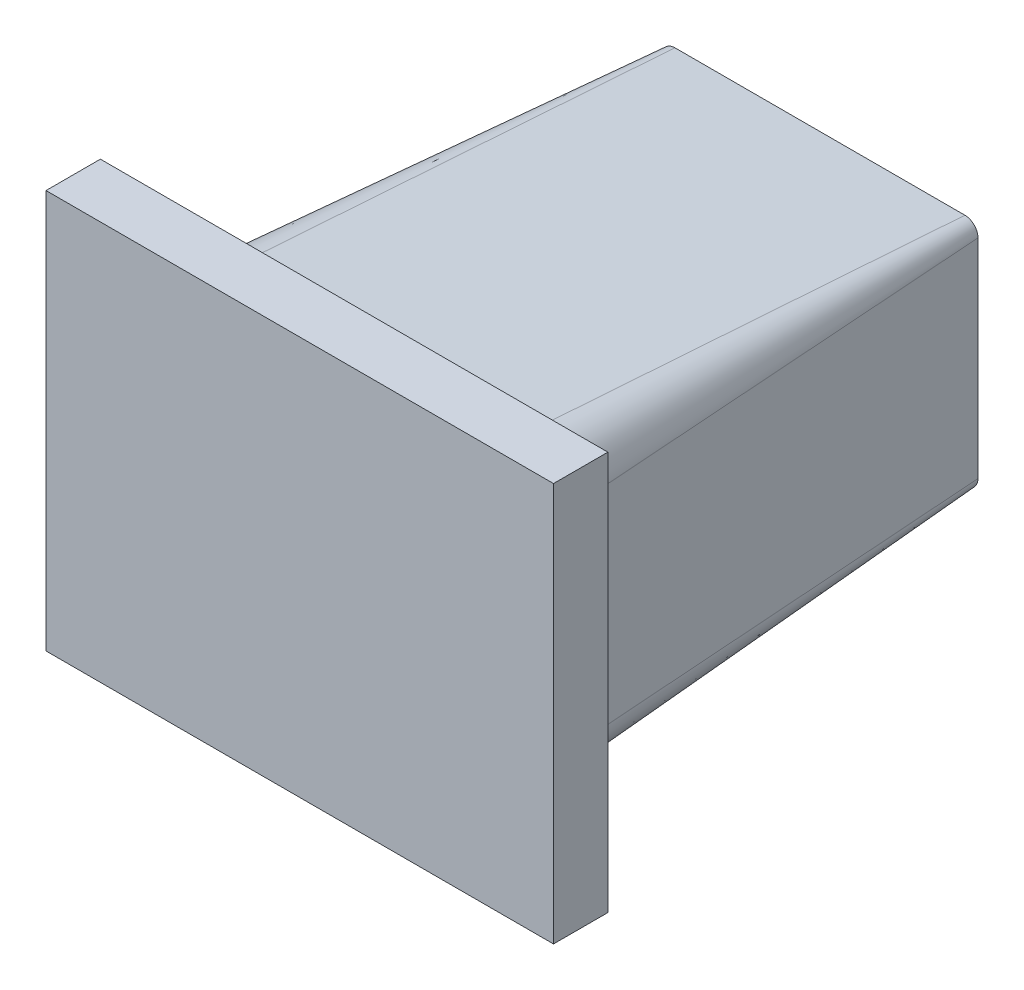
ISO-10303-21;
HEADER;
FILE_DESCRIPTION(('STEP AP214'),'2;1');
FILE_NAME('part.step','',(''),(''),'','','');
FILE_SCHEMA(('AUTOMOTIVE_DESIGN { 1 0 10303 214 1 1 1 1 }'));
ENDSEC;
DATA;
#1=APPLICATION_CONTEXT('core data for automotive mechanical design processes');
#2=APPLICATION_PROTOCOL_DEFINITION('international standard','automotive_design',2000,#1);
#3=PRODUCT_CONTEXT('',#1,'mechanical');
#4=PRODUCT('Part','Part','',(#3));
#5=PRODUCT_RELATED_PRODUCT_CATEGORY('part','',(#4));
#6=PRODUCT_DEFINITION_FORMATION('','',#4);
#7=PRODUCT_DEFINITION_CONTEXT('part definition',#1,'design');
#8=PRODUCT_DEFINITION('design','',#6,#7);
#9=PRODUCT_DEFINITION_SHAPE('','',#8);
#10=(LENGTH_UNIT() NAMED_UNIT(*) SI_UNIT(.MILLI.,.METRE.));
#11=(NAMED_UNIT(*) PLANE_ANGLE_UNIT() SI_UNIT($,.RADIAN.));
#12=(NAMED_UNIT(*) SI_UNIT($,.STERADIAN.) SOLID_ANGLE_UNIT());
#13=UNCERTAINTY_MEASURE_WITH_UNIT(LENGTH_MEASURE(1.E-05),#10,'distance_accuracy_value','');
#14=(GEOMETRIC_REPRESENTATION_CONTEXT(3) GLOBAL_UNCERTAINTY_ASSIGNED_CONTEXT((#13)) GLOBAL_UNIT_ASSIGNED_CONTEXT((#10,
#11,#12)) REPRESENTATION_CONTEXT('',''));
#15=CARTESIAN_POINT('',(0.,0.,0.));
#16=DIRECTION('',(0.,0.,1.));
#17=DIRECTION('',(1.,0.,0.));
#18=AXIS2_PLACEMENT_3D('',#15,#16,#17);
#19=CARTESIAN_POINT('',(-80.,-57.5,-257.));
#20=DIRECTION('',(0.,0.,-1.));
#21=DIRECTION('',(0.,1.,0.));
#22=AXIS2_PLACEMENT_3D('',#19,#20,#21);
#23=PLANE('',#22);
#24=CARTESIAN_POINT('',(-80.,-57.5,-257.));
#25=DIRECTION('',(0.,0.,-1.));
#26=DIRECTION('',(0.,1.,0.));
#27=AXIS2_PLACEMENT_3D('',#24,#25,#26);
#28=CIRCLE('',#27,7.20245474158701);
#29=CARTESIAN_POINT('',(-87.202454741587,-57.5,-257.));
#30=VERTEX_POINT('',#29);
#31=CARTESIAN_POINT('',(-80.0000000000001,-64.702454741587,-257.));
#32=VERTEX_POINT('',#31);
#33=EDGE_CURVE('E149',#30,#32,#28,.F.);
#34=ORIENTED_EDGE('',*,*,#33,.F.);
#35=DIRECTION('',(0.,1.,0.));
#36=VECTOR('',#35,1.);
#37=CARTESIAN_POINT('',(-87.202454741587,-57.5,-257.));
#38=LINE('',#37,#36);
#39=CARTESIAN_POINT('',(-87.202454741587,57.5000000000001,-257.));
#40=VERTEX_POINT('',#39);
#41=EDGE_CURVE('E184',#40,#30,#38,.F.);
#42=ORIENTED_EDGE('',*,*,#41,.F.);
#43=CARTESIAN_POINT('',(-80.,57.5,-257.));
#44=DIRECTION('',(0.,0.,-1.));
#45=DIRECTION('',(0.,1.,0.));
#46=AXIS2_PLACEMENT_3D('',#43,#44,#45);
#47=CIRCLE('',#46,7.20245474158703);
#48=CARTESIAN_POINT('',(-80.,64.702454741587,-257.));
#49=VERTEX_POINT('',#48);
#50=EDGE_CURVE('E181',#49,#40,#47,.F.);
#51=ORIENTED_EDGE('',*,*,#50,.F.);
#52=DIRECTION('',(1.,0.,0.));
#53=VECTOR('',#52,1.);
#54=CARTESIAN_POINT('',(-80.,64.702454741587,-257.));
#55=LINE('',#54,#53);
#56=CARTESIAN_POINT('',(80.,64.702454741587,-257.));
#57=VERTEX_POINT('',#56);
#58=EDGE_CURVE('E177',#57,#49,#55,.F.);
#59=ORIENTED_EDGE('',*,*,#58,.F.);
#60=CARTESIAN_POINT('',(80.,57.5,-257.));
#61=DIRECTION('',(0.,0.,-1.));
#62=DIRECTION('',(0.,1.,0.));
#63=AXIS2_PLACEMENT_3D('',#60,#61,#62);
#64=CIRCLE('',#63,7.20245474158703);
#65=CARTESIAN_POINT('',(87.202454741587,57.5,-257.));
#66=VERTEX_POINT('',#65);
#67=EDGE_CURVE('E172',#66,#57,#64,.F.);
#68=ORIENTED_EDGE('',*,*,#67,.F.);
#69=DIRECTION('',(0.,-1.,0.));
#70=VECTOR('',#69,1.);
#71=CARTESIAN_POINT('',(87.202454741587,-57.5,-257.));
#72=LINE('',#71,#70);
#73=CARTESIAN_POINT('',(87.202454741587,-57.5,-257.));
#74=VERTEX_POINT('',#73);
#75=EDGE_CURVE('E167',#74,#66,#72,.F.);
#76=ORIENTED_EDGE('',*,*,#75,.F.);
#77=CARTESIAN_POINT('',(80.,-57.5,-257.));
#78=DIRECTION('',(0.,0.,-1.));
#79=DIRECTION('',(0.,1.,0.));
#80=AXIS2_PLACEMENT_3D('',#77,#78,#79);
#81=CIRCLE('',#80,7.20245474158701);
#82=CARTESIAN_POINT('',(80.,-64.702454741587,-257.));
#83=VERTEX_POINT('',#82);
#84=EDGE_CURVE('E162',#83,#74,#81,.F.);
#85=ORIENTED_EDGE('',*,*,#84,.F.);
#86=DIRECTION('',(-1.,0.,0.));
#87=VECTOR('',#86,1.);
#88=CARTESIAN_POINT('',(-80.,-64.702454741587,-257.));
#89=LINE('',#88,#87);
#90=EDGE_CURVE('E152',#32,#83,#89,.F.);
#91=ORIENTED_EDGE('',*,*,#90,.F.);
#92=EDGE_LOOP('',(#34,#42,#51,#59,#68,#76,#85,#91));
#93=FACE_BOUND('',#92,.T.);
#94=ADVANCED_FACE('F32',(#93),#23,.T.);
#95=CARTESIAN_POINT('',(-87.0073078492205,-57.5,-259.790730578768));
#96=DIRECTION('',(-0.997564050259824,0.,-0.0697564737441255));
#97=DIRECTION('',(0.0697564737441255,0.,-0.997564050259824));
#98=AXIS2_PLACEMENT_3D('',#95,#96,#97);
#99=PLANE('',#98);
#100=ORIENTED_EDGE('',*,*,#41,.T.);
#101=DIRECTION('',(-0.0697564737441255,0.,0.997564050259824));
#102=VECTOR('',#101,1.);
#103=CARTESIAN_POINT('',(-87.0073078492205,-57.5,-259.790730578768));
#104=LINE('',#103,#102);
#105=CARTESIAN_POINT('',(-105.173645411069,-57.5,0.));
#106=VERTEX_POINT('',#105);
#107=EDGE_CURVE('E158',#106,#30,#104,.F.);
#108=ORIENTED_EDGE('',*,*,#107,.F.);
#109=DIRECTION('',(0.,1.,0.));
#110=VECTOR('',#109,1.);
#111=CARTESIAN_POINT('',(-105.173645411069,-57.5,0.));
#112=LINE('',#111,#110);
#113=CARTESIAN_POINT('',(-105.173645411069,57.5000000000001,0.));
#114=VERTEX_POINT('',#113);
#115=EDGE_CURVE('E35',#114,#106,#112,.F.);
#116=ORIENTED_EDGE('',*,*,#115,.F.);
#117=DIRECTION('',(0.0697564737441255,0.,-0.997564050259824));
#118=VECTOR('',#117,1.);
#119=CARTESIAN_POINT('',(-87.0073078492205,57.5000000000001,-259.790730578768));
#120=LINE('',#119,#118);
#121=EDGE_CURVE('E160',#114,#40,#120,.T.);
#122=ORIENTED_EDGE('',*,*,#121,.T.);
#123=EDGE_LOOP('',(#100,#108,#116,#122));
#124=FACE_BOUND('',#123,.T.);
#125=ADVANCED_FACE('F211',(#124),#99,.T.);
#126=CARTESIAN_POINT('',(-80.,57.5,-259.790730578768));
#127=DIRECTION('',(0.,0.,1.));
#128=DIRECTION('',(0.,-1.,0.));
#129=AXIS2_PLACEMENT_3D('',#126,#127,#128);
#130=CONICAL_SURFACE('',#129,7.00730784922054,0.0698131700797733);
#131=ORIENTED_EDGE('',*,*,#50,.T.);
#132=ORIENTED_EDGE('',*,*,#121,.F.);
#133=CARTESIAN_POINT('',(-80.,57.5,0.));
#134=DIRECTION('',(0.,0.,-1.));
#135=DIRECTION('',(0.,1.,0.));
#136=AXIS2_PLACEMENT_3D('',#133,#134,#135);
#137=CIRCLE('',#136,25.1736454110692);
#138=CARTESIAN_POINT('',(-80.,82.6736454110692,0.));
#139=VERTEX_POINT('',#138);
#140=EDGE_CURVE('E203',#139,#114,#137,.F.);
#141=ORIENTED_EDGE('',*,*,#140,.F.);
#142=DIRECTION('',(0.,0.0697564737441255,0.997564050259824));
#143=VECTOR('',#142,1.);
#144=CARTESIAN_POINT('',(-80.,64.5073078492205,-259.790730578768));
#145=LINE('',#144,#143);
#146=EDGE_CURVE('E56',#139,#49,#145,.F.);
#147=ORIENTED_EDGE('',*,*,#146,.T.);
#148=EDGE_LOOP('',(#131,#132,#141,#147));
#149=FACE_BOUND('',#148,.T.);
#150=ADVANCED_FACE('F214',(#149),#130,.T.);
#151=CARTESIAN_POINT('',(80.,64.5073078492205,-259.790730578768));
#152=DIRECTION('',(0.,0.997564050259824,-0.0697564737441255));
#153=DIRECTION('',(0.,0.0697564737441255,0.997564050259824));
#154=AXIS2_PLACEMENT_3D('',#151,#152,#153);
#155=PLANE('',#154);
#156=ORIENTED_EDGE('',*,*,#58,.T.);
#157=ORIENTED_EDGE('',*,*,#146,.F.);
#158=DIRECTION('',(1.,0.,0.));
#159=VECTOR('',#158,1.);
#160=CARTESIAN_POINT('',(-80.,82.6736454110692,0.));
#161=LINE('',#160,#159);
#162=CARTESIAN_POINT('',(80.,82.6736454110693,0.));
#163=VERTEX_POINT('',#162);
#164=EDGE_CURVE('E201',#163,#139,#161,.F.);
#165=ORIENTED_EDGE('',*,*,#164,.F.);
#166=DIRECTION('',(0.,0.0697564737441255,0.997564050259824));
#167=VECTOR('',#166,1.);
#168=CARTESIAN_POINT('',(80.,64.5073078492205,-259.790730578768));
#169=LINE('',#168,#167);
#170=EDGE_CURVE('E175',#163,#57,#169,.F.);
#171=ORIENTED_EDGE('',*,*,#170,.T.);
#172=EDGE_LOOP('',(#156,#157,#165,#171));
#173=FACE_BOUND('',#172,.T.);
#174=ADVANCED_FACE('F235',(#173),#155,.T.);
#175=CARTESIAN_POINT('',(80.,57.5,-259.790730578768));
#176=DIRECTION('',(0.,0.,1.));
#177=DIRECTION('',(0.,-1.,0.));
#178=AXIS2_PLACEMENT_3D('',#175,#176,#177);
#179=CONICAL_SURFACE('',#178,7.00730784922054,0.0698131700797733);
#180=ORIENTED_EDGE('',*,*,#67,.T.);
#181=ORIENTED_EDGE('',*,*,#170,.F.);
#182=CARTESIAN_POINT('',(80.,57.5,0.));
#183=DIRECTION('',(0.,0.,-1.));
#184=DIRECTION('',(0.,1.,0.));
#185=AXIS2_PLACEMENT_3D('',#182,#183,#184);
#186=CIRCLE('',#185,25.1736454110692);
#187=CARTESIAN_POINT('',(105.173645411069,57.5,0.));
#188=VERTEX_POINT('',#187);
#189=EDGE_CURVE('E198',#188,#163,#186,.F.);
#190=ORIENTED_EDGE('',*,*,#189,.F.);
#191=DIRECTION('',(0.0697564737441255,0.,0.997564050259824));
#192=VECTOR('',#191,1.);
#193=CARTESIAN_POINT('',(87.0073078492205,57.5,-259.790730578768));
#194=LINE('',#193,#192);
#195=EDGE_CURVE('E170',#188,#66,#194,.F.);
#196=ORIENTED_EDGE('',*,*,#195,.T.);
#197=EDGE_LOOP('',(#180,#181,#190,#196));
#198=FACE_BOUND('',#197,.T.);
#199=ADVANCED_FACE('F234',(#198),#179,.T.);
#200=CARTESIAN_POINT('',(87.0073078492205,-57.5,-259.790730578768));
#201=DIRECTION('',(0.997564050259824,0.,-0.0697564737441255));
#202=DIRECTION('',(0.0697564737441255,0.,0.997564050259824));
#203=AXIS2_PLACEMENT_3D('',#200,#201,#202);
#204=PLANE('',#203);
#205=ORIENTED_EDGE('',*,*,#75,.T.);
#206=ORIENTED_EDGE('',*,*,#195,.F.);
#207=DIRECTION('',(0.,-1.,0.));
#208=VECTOR('',#207,1.);
#209=CARTESIAN_POINT('',(105.173645411069,-57.5,0.));
#210=LINE('',#209,#208);
#211=CARTESIAN_POINT('',(105.173645411069,-57.5,0.));
#212=VERTEX_POINT('',#211);
#213=EDGE_CURVE('E195',#212,#188,#210,.F.);
#214=ORIENTED_EDGE('',*,*,#213,.F.);
#215=DIRECTION('',(0.0697564737441255,0.,0.997564050259824));
#216=VECTOR('',#215,1.);
#217=CARTESIAN_POINT('',(87.0073078492205,-57.5,-259.790730578768));
#218=LINE('',#217,#216);
#219=EDGE_CURVE('E165',#212,#74,#218,.F.);
#220=ORIENTED_EDGE('',*,*,#219,.T.);
#221=EDGE_LOOP('',(#205,#206,#214,#220));
#222=FACE_BOUND('',#221,.T.);
#223=ADVANCED_FACE('F231',(#222),#204,.T.);
#224=CARTESIAN_POINT('',(80.,-57.5,-259.790730578768));
#225=DIRECTION('',(0.,0.,1.));
#226=DIRECTION('',(0.,-1.,0.));
#227=AXIS2_PLACEMENT_3D('',#224,#225,#226);
#228=CONICAL_SURFACE('',#227,7.00730784922053,0.0698131700797733);
#229=ORIENTED_EDGE('',*,*,#84,.T.);
#230=ORIENTED_EDGE('',*,*,#219,.F.);
#231=CARTESIAN_POINT('',(80.,-57.5,0.));
#232=DIRECTION('',(0.,0.,-1.));
#233=DIRECTION('',(0.,1.,0.));
#234=AXIS2_PLACEMENT_3D('',#231,#232,#233);
#235=CIRCLE('',#234,25.1736454110692);
#236=CARTESIAN_POINT('',(80.,-82.6736454110692,0.));
#237=VERTEX_POINT('',#236);
#238=EDGE_CURVE('E192',#237,#212,#235,.F.);
#239=ORIENTED_EDGE('',*,*,#238,.F.);
#240=DIRECTION('',(0.,-0.0697564737441255,0.997564050259824));
#241=VECTOR('',#240,1.);
#242=CARTESIAN_POINT('',(80.,-64.5073078492205,-259.790730578768));
#243=LINE('',#242,#241);
#244=EDGE_CURVE('E40',#237,#83,#243,.F.);
#245=ORIENTED_EDGE('',*,*,#244,.T.);
#246=EDGE_LOOP('',(#229,#230,#239,#245));
#247=FACE_BOUND('',#246,.T.);
#248=ADVANCED_FACE('F227',(#247),#228,.T.);
#249=CARTESIAN_POINT('',(80.,-64.5073078492205,-259.790730578768));
#250=DIRECTION('',(0.,-0.997564050259824,-0.0697564737441255));
#251=DIRECTION('',(0.,0.0697564737441255,-0.997564050259824));
#252=AXIS2_PLACEMENT_3D('',#249,#250,#251);
#253=PLANE('',#252);
#254=ORIENTED_EDGE('',*,*,#90,.T.);
#255=ORIENTED_EDGE('',*,*,#244,.F.);
#256=DIRECTION('',(-1.,0.,0.));
#257=VECTOR('',#256,1.);
#258=CARTESIAN_POINT('',(-80.,-82.6736454110692,0.));
#259=LINE('',#258,#257);
#260=CARTESIAN_POINT('',(-80.0000000000001,-82.6736454110692,0.));
#261=VERTEX_POINT('',#260);
#262=EDGE_CURVE('E189',#261,#237,#259,.F.);
#263=ORIENTED_EDGE('',*,*,#262,.F.);
#264=DIRECTION('',(0.,0.0697564737441255,-0.997564050259824));
#265=VECTOR('',#264,1.);
#266=CARTESIAN_POINT('',(-80.0000000000001,-64.5073078492205,-259.790730578768));
#267=LINE('',#266,#265);
#268=EDGE_CURVE('E11',#261,#32,#267,.T.);
#269=ORIENTED_EDGE('',*,*,#268,.T.);
#270=EDGE_LOOP('',(#254,#255,#263,#269));
#271=FACE_BOUND('',#270,.T.);
#272=ADVANCED_FACE('F223',(#271),#253,.T.);
#273=CARTESIAN_POINT('',(-80.,-57.5,-259.790730578768));
#274=DIRECTION('',(0.,0.,1.));
#275=DIRECTION('',(0.,1.,0.));
#276=AXIS2_PLACEMENT_3D('',#273,#274,#275);
#277=CONICAL_SURFACE('',#276,7.00730784922052,0.0698131700797733);
#278=ORIENTED_EDGE('',*,*,#33,.T.);
#279=ORIENTED_EDGE('',*,*,#268,.F.);
#280=CARTESIAN_POINT('',(-80.,-57.5,0.));
#281=DIRECTION('',(0.,0.,-1.));
#282=DIRECTION('',(0.,1.,0.));
#283=AXIS2_PLACEMENT_3D('',#280,#281,#282);
#284=CIRCLE('',#283,25.1736454110692);
#285=EDGE_CURVE('E48',#106,#261,#284,.F.);
#286=ORIENTED_EDGE('',*,*,#285,.F.);
#287=ORIENTED_EDGE('',*,*,#107,.T.);
#288=EDGE_LOOP('',(#278,#279,#286,#287));
#289=FACE_BOUND('',#288,.T.);
#290=ADVANCED_FACE('F220',(#289),#277,.T.);
#291=CARTESIAN_POINT('',(140.,110.,30.));
#292=DIRECTION('',(-1.,0.,0.));
#293=DIRECTION('',(0.,0.,1.));
#294=AXIS2_PLACEMENT_3D('',#291,#292,#293);
#295=PLANE('',#294);
#296=DIRECTION('',(0.,1.,0.));
#297=VECTOR('',#296,1.);
#298=CARTESIAN_POINT('',(140.,110.,0.));
#299=LINE('',#298,#297);
#300=CARTESIAN_POINT('',(140.,-110.,0.));
#301=VERTEX_POINT('',#300);
#302=CARTESIAN_POINT('',(140.,110.,0.));
#303=VERTEX_POINT('',#302);
#304=EDGE_CURVE('E148',#301,#303,#299,.T.);
#305=ORIENTED_EDGE('',*,*,#304,.T.);
#306=DIRECTION('',(0.,0.,-1.));
#307=VECTOR('',#306,1.);
#308=CARTESIAN_POINT('',(140.,110.,30.));
#309=LINE('',#308,#307);
#310=CARTESIAN_POINT('',(140.,110.,30.));
#311=VERTEX_POINT('',#310);
#312=EDGE_CURVE('E128',#311,#303,#309,.T.);
#313=ORIENTED_EDGE('',*,*,#312,.F.);
#314=DIRECTION('',(0.,1.,0.));
#315=VECTOR('',#314,1.);
#316=CARTESIAN_POINT('',(140.,110.,30.));
#317=LINE('',#316,#315);
#318=CARTESIAN_POINT('',(140.,-110.,30.));
#319=VERTEX_POINT('',#318);
#320=EDGE_CURVE('E135',#319,#311,#317,.T.);
#321=ORIENTED_EDGE('',*,*,#320,.F.);
#322=DIRECTION('',(0.,0.,-1.));
#323=VECTOR('',#322,1.);
#324=CARTESIAN_POINT('',(140.,-110.,30.));
#325=LINE('',#324,#323);
#326=EDGE_CURVE('E354',#319,#301,#325,.T.);
#327=ORIENTED_EDGE('',*,*,#326,.T.);
#328=EDGE_LOOP('',(#305,#313,#321,#327));
#329=FACE_BOUND('',#328,.T.);
#330=ADVANCED_FACE('F146',(#329),#295,.F.);
#331=CARTESIAN_POINT('',(-140.,110.,30.));
#332=DIRECTION('',(0.,-1.,0.));
#333=DIRECTION('',(0.,0.,-1.));
#334=AXIS2_PLACEMENT_3D('',#331,#332,#333);
#335=PLANE('',#334);
#336=DIRECTION('',(-1.,0.,0.));
#337=VECTOR('',#336,1.);
#338=CARTESIAN_POINT('',(-140.,110.,0.));
#339=LINE('',#338,#337);
#340=CARTESIAN_POINT('',(-140.,110.,0.));
#341=VERTEX_POINT('',#340);
#342=EDGE_CURVE('E360',#303,#341,#339,.T.);
#343=ORIENTED_EDGE('',*,*,#342,.T.);
#344=DIRECTION('',(0.,0.,-1.));
#345=VECTOR('',#344,1.);
#346=CARTESIAN_POINT('',(-140.,110.,30.));
#347=LINE('',#346,#345);
#348=CARTESIAN_POINT('',(-140.,110.,30.));
#349=VERTEX_POINT('',#348);
#350=EDGE_CURVE('E131',#349,#341,#347,.T.);
#351=ORIENTED_EDGE('',*,*,#350,.F.);
#352=DIRECTION('',(-1.,0.,0.));
#353=VECTOR('',#352,1.);
#354=CARTESIAN_POINT('',(-140.,110.,30.));
#355=LINE('',#354,#353);
#356=EDGE_CURVE('E124',#311,#349,#355,.T.);
#357=ORIENTED_EDGE('',*,*,#356,.F.);
#358=ORIENTED_EDGE('',*,*,#312,.T.);
#359=EDGE_LOOP('',(#343,#351,#357,#358));
#360=FACE_BOUND('',#359,.T.);
#361=ADVANCED_FACE('F126',(#360),#335,.F.);
#362=CARTESIAN_POINT('',(-140.,110.,30.));
#363=DIRECTION('',(1.,0.,0.));
#364=DIRECTION('',(0.,0.,-1.));
#365=AXIS2_PLACEMENT_3D('',#362,#363,#364);
#366=PLANE('',#365);
#367=DIRECTION('',(0.,-1.,0.));
#368=VECTOR('',#367,1.);
#369=CARTESIAN_POINT('',(-140.,110.,0.));
#370=LINE('',#369,#368);
#371=CARTESIAN_POINT('',(-140.,-110.,0.));
#372=VERTEX_POINT('',#371);
#373=EDGE_CURVE('E357',#341,#372,#370,.T.);
#374=ORIENTED_EDGE('',*,*,#373,.T.);
#375=DIRECTION('',(0.,0.,-1.));
#376=VECTOR('',#375,1.);
#377=CARTESIAN_POINT('',(-140.,-110.,30.));
#378=LINE('',#377,#376);
#379=CARTESIAN_POINT('',(-140.,-110.,30.));
#380=VERTEX_POINT('',#379);
#381=EDGE_CURVE('E154',#380,#372,#378,.T.);
#382=ORIENTED_EDGE('',*,*,#381,.F.);
#383=DIRECTION('',(0.,-1.,0.));
#384=VECTOR('',#383,1.);
#385=CARTESIAN_POINT('',(-140.,110.,30.));
#386=LINE('',#385,#384);
#387=EDGE_CURVE('E134',#349,#380,#386,.T.);
#388=ORIENTED_EDGE('',*,*,#387,.F.);
#389=ORIENTED_EDGE('',*,*,#350,.T.);
#390=EDGE_LOOP('',(#374,#382,#388,#389));
#391=FACE_BOUND('',#390,.T.);
#392=ADVANCED_FACE('F313',(#391),#366,.F.);
#393=CARTESIAN_POINT('',(-140.,-110.,30.));
#394=DIRECTION('',(0.,1.,0.));
#395=DIRECTION('',(0.,0.,1.));
#396=AXIS2_PLACEMENT_3D('',#393,#394,#395);
#397=PLANE('',#396);
#398=DIRECTION('',(1.,0.,0.));
#399=VECTOR('',#398,1.);
#400=CARTESIAN_POINT('',(-140.,-110.,0.));
#401=LINE('',#400,#399);
#402=EDGE_CURVE('E144',#372,#301,#401,.T.);
#403=ORIENTED_EDGE('',*,*,#402,.T.);
#404=ORIENTED_EDGE('',*,*,#326,.F.);
#405=DIRECTION('',(1.,0.,0.));
#406=VECTOR('',#405,1.);
#407=CARTESIAN_POINT('',(-140.,-110.,30.));
#408=LINE('',#407,#406);
#409=EDGE_CURVE('E140',#380,#319,#408,.T.);
#410=ORIENTED_EDGE('',*,*,#409,.F.);
#411=ORIENTED_EDGE('',*,*,#381,.T.);
#412=EDGE_LOOP('',(#403,#404,#410,#411));
#413=FACE_BOUND('',#412,.T.);
#414=ADVANCED_FACE('F322',(#413),#397,.F.);
#415=CARTESIAN_POINT('',(0.,0.,30.));
#416=DIRECTION('',(0.,0.,1.));
#417=DIRECTION('',(1.,0.,0.));
#418=AXIS2_PLACEMENT_3D('',#415,#416,#417);
#419=PLANE('',#418);
#420=ORIENTED_EDGE('',*,*,#320,.T.);
#421=ORIENTED_EDGE('',*,*,#356,.T.);
#422=ORIENTED_EDGE('',*,*,#387,.T.);
#423=ORIENTED_EDGE('',*,*,#409,.T.);
#424=EDGE_LOOP('',(#420,#421,#422,#423));
#425=FACE_BOUND('',#424,.T.);
#426=ADVANCED_FACE('F138',(#425),#419,.T.);
#427=CARTESIAN_POINT('',(0.,0.,0.));
#428=DIRECTION('',(0.,0.,1.));
#429=DIRECTION('',(1.,0.,0.));
#430=AXIS2_PLACEMENT_3D('',#427,#428,#429);
#431=PLANE('',#430);
#432=ORIENTED_EDGE('',*,*,#140,.T.);
#433=ORIENTED_EDGE('',*,*,#115,.T.);
#434=ORIENTED_EDGE('',*,*,#285,.T.);
#435=ORIENTED_EDGE('',*,*,#262,.T.);
#436=ORIENTED_EDGE('',*,*,#238,.T.);
#437=ORIENTED_EDGE('',*,*,#213,.T.);
#438=ORIENTED_EDGE('',*,*,#189,.T.);
#439=ORIENTED_EDGE('',*,*,#164,.T.);
#440=EDGE_LOOP('',(#432,#433,#434,#435,#436,#437,#438,#439));
#441=FACE_BOUND('',#440,.T.);
#442=ORIENTED_EDGE('',*,*,#304,.F.);
#443=ORIENTED_EDGE('',*,*,#402,.F.);
#444=ORIENTED_EDGE('',*,*,#373,.F.);
#445=ORIENTED_EDGE('',*,*,#342,.F.);
#446=EDGE_LOOP('',(#442,#443,#444,#445));
#447=FACE_BOUND('',#446,.T.);
#448=ADVANCED_FACE('F207',(#441,#447),#431,.F.);
#449=CLOSED_SHELL('',(#94,#125,#150,#174,#199,#223,#248,#272,#290,#330,#361,#392,#414,#426,#448));
#450=MANIFOLD_SOLID_BREP('B2',#449);
#451=ADVANCED_BREP_SHAPE_REPRESENTATION('',(#18,#450),#14);
#452=SHAPE_DEFINITION_REPRESENTATION(#9,#451);
ENDSEC;
END-ISO-10303-21;
